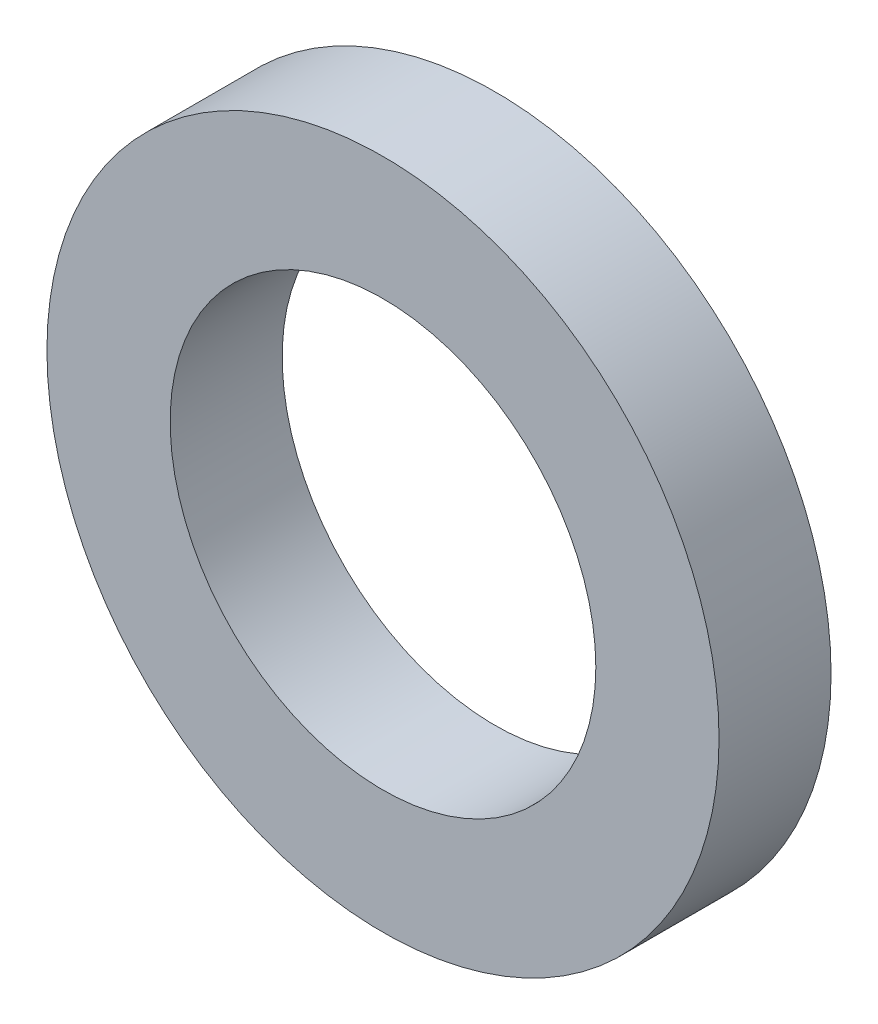
ISO-10303-21;
HEADER;
FILE_DESCRIPTION(('STEP AP214'),'2;1');
FILE_NAME('part.step','',(''),(''),'','','');
FILE_SCHEMA(('AUTOMOTIVE_DESIGN { 1 0 10303 214 1 1 1 1 }'));
ENDSEC;
DATA;
#1=APPLICATION_CONTEXT('core data for automotive mechanical design processes');
#2=APPLICATION_PROTOCOL_DEFINITION('international standard','automotive_design',2000,#1);
#3=PRODUCT_CONTEXT('',#1,'mechanical');
#4=PRODUCT('Part','Part','',(#3));
#5=PRODUCT_RELATED_PRODUCT_CATEGORY('part','',(#4));
#6=PRODUCT_DEFINITION_FORMATION('','',#4);
#7=PRODUCT_DEFINITION_CONTEXT('part definition',#1,'design');
#8=PRODUCT_DEFINITION('design','',#6,#7);
#9=PRODUCT_DEFINITION_SHAPE('','',#8);
#10=(LENGTH_UNIT() NAMED_UNIT(*) SI_UNIT(.MILLI.,.METRE.));
#11=(NAMED_UNIT(*) PLANE_ANGLE_UNIT() SI_UNIT($,.RADIAN.));
#12=(NAMED_UNIT(*) SI_UNIT($,.STERADIAN.) SOLID_ANGLE_UNIT());
#13=UNCERTAINTY_MEASURE_WITH_UNIT(LENGTH_MEASURE(1.E-05),#10,'distance_accuracy_value','');
#14=(GEOMETRIC_REPRESENTATION_CONTEXT(3) GLOBAL_UNCERTAINTY_ASSIGNED_CONTEXT((#13)) GLOBAL_UNIT_ASSIGNED_CONTEXT((#10,
#11,#12)) REPRESENTATION_CONTEXT('',''));
#15=CARTESIAN_POINT('',(0.,0.,0.));
#16=DIRECTION('',(0.,0.,1.));
#17=DIRECTION('',(1.,0.,0.));
#18=AXIS2_PLACEMENT_3D('',#15,#16,#17);
#19=CARTESIAN_POINT('',(0.,0.,0.5));
#20=DIRECTION('',(0.,0.,1.));
#21=DIRECTION('',(1.,0.,0.));
#22=AXIS2_PLACEMENT_3D('',#19,#20,#21);
#23=PLANE('',#22);
#24=CARTESIAN_POINT('',(0.,0.,0.5));
#25=DIRECTION('',(0.,0.,1.));
#26=DIRECTION('',(1.,0.,0.));
#27=AXIS2_PLACEMENT_3D('',#24,#25,#26);
#28=CIRCLE('',#27,3.);
#29=CARTESIAN_POINT('',(3.,0.,0.5));
#30=VERTEX_POINT('',#29);
#31=EDGE_CURVE('E10',#30,#30,#28,.T.);
#32=ORIENTED_EDGE('',*,*,#31,.T.);
#33=EDGE_LOOP('',(#32));
#34=FACE_BOUND('',#33,.T.);
#35=CARTESIAN_POINT('',(0.,0.,0.5));
#36=DIRECTION('',(0.,0.,1.));
#37=DIRECTION('',(1.,0.,0.));
#38=AXIS2_PLACEMENT_3D('',#35,#36,#37);
#39=CIRCLE('',#38,1.9);
#40=CARTESIAN_POINT('',(1.9,0.,0.5));
#41=VERTEX_POINT('',#40);
#42=EDGE_CURVE('E42',#41,#41,#39,.T.);
#43=ORIENTED_EDGE('',*,*,#42,.F.);
#44=EDGE_LOOP('',(#43));
#45=FACE_BOUND('',#44,.T.);
#46=ADVANCED_FACE('F31',(#34,#45),#23,.T.);
#47=CARTESIAN_POINT('',(0.,0.,-0.5));
#48=DIRECTION('',(0.,0.,1.));
#49=DIRECTION('',(1.,0.,0.));
#50=AXIS2_PLACEMENT_3D('',#47,#48,#49);
#51=PLANE('',#50);
#52=CARTESIAN_POINT('',(0.,0.,-0.5));
#53=DIRECTION('',(0.,0.,1.));
#54=DIRECTION('',(1.,0.,0.));
#55=AXIS2_PLACEMENT_3D('',#52,#53,#54);
#56=CIRCLE('',#55,3.);
#57=CARTESIAN_POINT('',(3.,0.,-0.5));
#58=VERTEX_POINT('',#57);
#59=EDGE_CURVE('E35',#58,#58,#56,.T.);
#60=ORIENTED_EDGE('',*,*,#59,.F.);
#61=EDGE_LOOP('',(#60));
#62=FACE_BOUND('',#61,.T.);
#63=CARTESIAN_POINT('',(0.,0.,-0.5));
#64=DIRECTION('',(0.,0.,1.));
#65=DIRECTION('',(1.,0.,0.));
#66=AXIS2_PLACEMENT_3D('',#63,#64,#65);
#67=CIRCLE('',#66,1.9);
#68=CARTESIAN_POINT('',(1.9,0.,-0.5));
#69=VERTEX_POINT('',#68);
#70=EDGE_CURVE('E44',#69,#69,#67,.T.);
#71=ORIENTED_EDGE('',*,*,#70,.T.);
#72=EDGE_LOOP('',(#71));
#73=FACE_BOUND('',#72,.T.);
#74=ADVANCED_FACE('F54',(#62,#73),#51,.F.);
#75=CARTESIAN_POINT('',(0.,0.,0.5));
#76=DIRECTION('',(0.,0.,-1.));
#77=DIRECTION('',(-1.,0.,0.));
#78=AXIS2_PLACEMENT_3D('',#75,#76,#77);
#79=CYLINDRICAL_SURFACE('',#78,3.);
#80=ORIENTED_EDGE('',*,*,#31,.F.);
#81=EDGE_LOOP('',(#80));
#82=FACE_BOUND('',#81,.T.);
#83=ORIENTED_EDGE('',*,*,#59,.T.);
#84=EDGE_LOOP('',(#83));
#85=FACE_BOUND('',#84,.T.);
#86=ADVANCED_FACE('F33',(#82,#85),#79,.T.);
#87=CARTESIAN_POINT('',(0.,0.,0.5));
#88=DIRECTION('',(0.,0.,-1.));
#89=DIRECTION('',(-1.,0.,0.));
#90=AXIS2_PLACEMENT_3D('',#87,#88,#89);
#91=CYLINDRICAL_SURFACE('',#90,1.9);
#92=ORIENTED_EDGE('',*,*,#42,.T.);
#93=EDGE_LOOP('',(#92));
#94=FACE_BOUND('',#93,.T.);
#95=ORIENTED_EDGE('',*,*,#70,.F.);
#96=EDGE_LOOP('',(#95));
#97=FACE_BOUND('',#96,.T.);
#98=ADVANCED_FACE('F50',(#94,#97),#91,.F.);
#99=CLOSED_SHELL('',(#46,#74,#86,#98));
#100=MANIFOLD_SOLID_BREP('B2',#99);
#101=ADVANCED_BREP_SHAPE_REPRESENTATION('',(#18,#100),#14);
#102=SHAPE_DEFINITION_REPRESENTATION(#9,#101);
ENDSEC;
END-ISO-10303-21;
